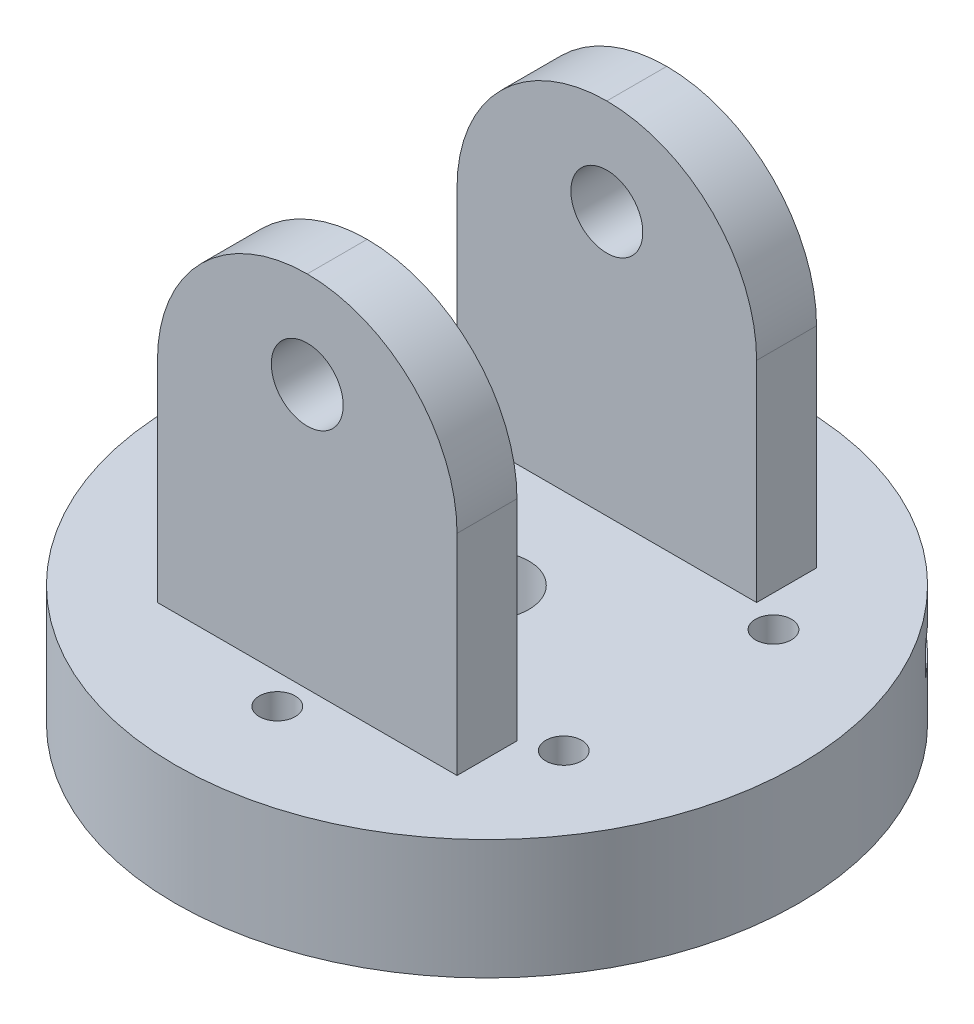
ISO-10303-21;
HEADER;
FILE_DESCRIPTION(('STEP AP214'),'2;1');
FILE_NAME('part.step','',(''),(''),'','','');
FILE_SCHEMA(('AUTOMOTIVE_DESIGN { 1 0 10303 214 1 1 1 1 }'));
ENDSEC;
DATA;
#1=APPLICATION_CONTEXT('core data for automotive mechanical design processes');
#2=APPLICATION_PROTOCOL_DEFINITION('international standard','automotive_design',2000,#1);
#3=PRODUCT_CONTEXT('',#1,'mechanical');
#4=PRODUCT('Part','Part','',(#3));
#5=PRODUCT_RELATED_PRODUCT_CATEGORY('part','',(#4));
#6=PRODUCT_DEFINITION_FORMATION('','',#4);
#7=PRODUCT_DEFINITION_CONTEXT('part definition',#1,'design');
#8=PRODUCT_DEFINITION('design','',#6,#7);
#9=PRODUCT_DEFINITION_SHAPE('','',#8);
#10=(LENGTH_UNIT() NAMED_UNIT(*) SI_UNIT(.MILLI.,.METRE.));
#11=(NAMED_UNIT(*) PLANE_ANGLE_UNIT() SI_UNIT($,.RADIAN.));
#12=(NAMED_UNIT(*) SI_UNIT($,.STERADIAN.) SOLID_ANGLE_UNIT());
#13=UNCERTAINTY_MEASURE_WITH_UNIT(LENGTH_MEASURE(1.E-05),#10,'distance_accuracy_value','');
#14=(GEOMETRIC_REPRESENTATION_CONTEXT(3) GLOBAL_UNCERTAINTY_ASSIGNED_CONTEXT((#13)) GLOBAL_UNIT_ASSIGNED_CONTEXT((#10,
#11,#12)) REPRESENTATION_CONTEXT('',''));
#15=CARTESIAN_POINT('',(0.,0.,0.));
#16=DIRECTION('',(0.,0.,1.));
#17=DIRECTION('',(1.,0.,0.));
#18=AXIS2_PLACEMENT_3D('',#15,#16,#17);
#19=CARTESIAN_POINT('',(0.,20.,35.));
#20=DIRECTION('',(0.,-1.,0.));
#21=DIRECTION('',(0.,0.,-1.));
#22=AXIS2_PLACEMENT_3D('',#19,#20,#21);
#23=CYLINDRICAL_SURFACE('',#22,1.6);
#24=CARTESIAN_POINT('',(0.,0.,35.));
#25=DIRECTION('',(0.,-1.,0.));
#26=DIRECTION('',(0.,0.,-1.));
#27=AXIS2_PLACEMENT_3D('',#24,#25,#26);
#28=CIRCLE('',#27,1.6);
#29=CARTESIAN_POINT('',(0.,0.,33.4));
#30=VERTEX_POINT('',#29);
#31=EDGE_CURVE('E262',#30,#30,#28,.T.);
#32=ORIENTED_EDGE('',*,*,#31,.T.);
#33=EDGE_LOOP('',(#32));
#34=FACE_BOUND('',#33,.T.);
#35=CARTESIAN_POINT('',(0.,11.,35.));
#36=DIRECTION('',(0.,1.,0.));
#37=DIRECTION('',(0.,0.,1.));
#38=AXIS2_PLACEMENT_3D('',#35,#36,#37);
#39=CIRCLE('',#38,1.6);
#40=CARTESIAN_POINT('',(0.,11.,36.6));
#41=VERTEX_POINT('',#40);
#42=EDGE_CURVE('E258',#41,#41,#39,.F.);
#43=ORIENTED_EDGE('',*,*,#42,.F.);
#44=EDGE_LOOP('',(#43));
#45=FACE_BOUND('',#44,.T.);
#46=ADVANCED_FACE('F39',(#34,#45),#23,.F.);
#47=CARTESIAN_POINT('',(30.3108891324554,20.,17.4999999999999));
#48=DIRECTION('',(0.,-1.,0.));
#49=DIRECTION('',(0.,0.,-1.));
#50=AXIS2_PLACEMENT_3D('',#47,#48,#49);
#51=CYLINDRICAL_SURFACE('',#50,1.6);
#52=CARTESIAN_POINT('',(30.3108891324554,0.,17.4999999999999));
#53=DIRECTION('',(0.,-1.,0.));
#54=DIRECTION('',(-0.86602540378444,0.,-0.499999999999998));
#55=AXIS2_PLACEMENT_3D('',#52,#53,#54);
#56=CIRCLE('',#55,1.6);
#57=CARTESIAN_POINT('',(28.9252484864003,0.,16.6999999999999));
#58=VERTEX_POINT('',#57);
#59=EDGE_CURVE('E245',#58,#58,#56,.T.);
#60=ORIENTED_EDGE('',*,*,#59,.T.);
#61=EDGE_LOOP('',(#60));
#62=FACE_BOUND('',#61,.T.);
#63=CARTESIAN_POINT('',(30.3108891324554,11.,17.4999999999999));
#64=DIRECTION('',(0.,1.,0.));
#65=DIRECTION('',(0.,0.,1.));
#66=AXIS2_PLACEMENT_3D('',#63,#64,#65);
#67=CIRCLE('',#66,1.6);
#68=CARTESIAN_POINT('',(30.3108891324554,11.,19.0999999999999));
#69=VERTEX_POINT('',#68);
#70=EDGE_CURVE('E402',#69,#69,#67,.F.);
#71=ORIENTED_EDGE('',*,*,#70,.F.);
#72=EDGE_LOOP('',(#71));
#73=FACE_BOUND('',#72,.T.);
#74=ADVANCED_FACE('F437',(#62,#73),#51,.F.);
#75=CARTESIAN_POINT('',(30.3108891324553,20.,-17.5000000000001));
#76=DIRECTION('',(0.,-1.,0.));
#77=DIRECTION('',(0.,0.,-1.));
#78=AXIS2_PLACEMENT_3D('',#75,#76,#77);
#79=CYLINDRICAL_SURFACE('',#78,1.6);
#80=CARTESIAN_POINT('',(30.3108891324553,10.,-17.5000000000001));
#81=DIRECTION('',(0.,-1.,0.));
#82=DIRECTION('',(0.,0.,-1.));
#83=AXIS2_PLACEMENT_3D('',#80,#81,#82);
#84=CIRCLE('',#83,1.6);
#85=CARTESIAN_POINT('',(30.3108891324553,10.,-19.1000000000001));
#86=VERTEX_POINT('',#85);
#87=EDGE_CURVE('E200',#86,#86,#84,.F.);
#88=ORIENTED_EDGE('',*,*,#87,.T.);
#89=EDGE_LOOP('',(#88));
#90=FACE_BOUND('',#89,.T.);
#91=CARTESIAN_POINT('',(30.3108891324553,0.,-17.5000000000001));
#92=DIRECTION('',(0.,-1.,0.));
#93=DIRECTION('',(-0.866025403784436,0.,0.500000000000004));
#94=AXIS2_PLACEMENT_3D('',#91,#92,#93);
#95=CIRCLE('',#94,1.6);
#96=CARTESIAN_POINT('',(28.9252484864002,0.,-16.7000000000001));
#97=VERTEX_POINT('',#96);
#98=EDGE_CURVE('E241',#97,#97,#95,.T.);
#99=ORIENTED_EDGE('',*,*,#98,.T.);
#100=EDGE_LOOP('',(#99));
#101=FACE_BOUND('',#100,.T.);
#102=ADVANCED_FACE('F443',(#90,#101),#79,.F.);
#103=CARTESIAN_POINT('',(0.,20.,-35.));
#104=DIRECTION('',(0.,-1.,0.));
#105=DIRECTION('',(0.,0.,-1.));
#106=AXIS2_PLACEMENT_3D('',#103,#104,#105);
#107=CYLINDRICAL_SURFACE('',#106,1.6);
#108=CARTESIAN_POINT('',(0.,10.,-35.));
#109=DIRECTION('',(0.,-1.,0.));
#110=DIRECTION('',(0.,0.,-1.));
#111=AXIS2_PLACEMENT_3D('',#108,#109,#110);
#112=CIRCLE('',#111,1.6);
#113=CARTESIAN_POINT('',(0.,10.,-36.6));
#114=VERTEX_POINT('',#113);
#115=EDGE_CURVE('E196',#114,#114,#112,.F.);
#116=ORIENTED_EDGE('',*,*,#115,.T.);
#117=EDGE_LOOP('',(#116));
#118=FACE_BOUND('',#117,.T.);
#119=CARTESIAN_POINT('',(0.,0.,-35.));
#120=DIRECTION('',(0.,-1.,0.));
#121=DIRECTION('',(0.,0.,1.));
#122=AXIS2_PLACEMENT_3D('',#119,#120,#121);
#123=CIRCLE('',#122,1.6);
#124=CARTESIAN_POINT('',(0.,0.,-33.4));
#125=VERTEX_POINT('',#124);
#126=EDGE_CURVE('E246',#125,#125,#123,.T.);
#127=ORIENTED_EDGE('',*,*,#126,.T.);
#128=EDGE_LOOP('',(#127));
#129=FACE_BOUND('',#128,.T.);
#130=ADVANCED_FACE('F612',(#118,#129),#107,.F.);
#131=CARTESIAN_POINT('',(-30.3108891324555,20.,-17.4999999999997));
#132=DIRECTION('',(0.,-1.,0.));
#133=DIRECTION('',(0.,0.,-1.));
#134=AXIS2_PLACEMENT_3D('',#131,#132,#133);
#135=CYLINDRICAL_SURFACE('',#134,1.6);
#136=CARTESIAN_POINT('',(-30.3108891324555,10.,-17.4999999999997));
#137=DIRECTION('',(0.,-1.,0.));
#138=DIRECTION('',(0.,0.,-1.));
#139=AXIS2_PLACEMENT_3D('',#136,#137,#138);
#140=CIRCLE('',#139,1.6);
#141=CARTESIAN_POINT('',(-30.3108891324555,10.,-19.0999999999997));
#142=VERTEX_POINT('',#141);
#143=EDGE_CURVE('E192',#142,#142,#140,.F.);
#144=ORIENTED_EDGE('',*,*,#143,.T.);
#145=EDGE_LOOP('',(#144));
#146=FACE_BOUND('',#145,.T.);
#147=CARTESIAN_POINT('',(-30.3108891324555,0.,-17.4999999999997));
#148=DIRECTION('',(0.,-1.,0.));
#149=DIRECTION('',(0.866025403784443,0.,0.499999999999992));
#150=AXIS2_PLACEMENT_3D('',#147,#148,#149);
#151=CIRCLE('',#150,1.6);
#152=CARTESIAN_POINT('',(-28.9252484864004,0.,-16.6999999999997));
#153=VERTEX_POINT('',#152);
#154=EDGE_CURVE('E250',#153,#153,#151,.T.);
#155=ORIENTED_EDGE('',*,*,#154,.T.);
#156=EDGE_LOOP('',(#155));
#157=FACE_BOUND('',#156,.T.);
#158=ADVANCED_FACE('F605',(#146,#157),#135,.F.);
#159=CARTESIAN_POINT('',(-30.3108891324552,20.,17.5000000000004));
#160=DIRECTION('',(0.,-1.,0.));
#161=DIRECTION('',(0.,0.,-1.));
#162=AXIS2_PLACEMENT_3D('',#159,#160,#161);
#163=CYLINDRICAL_SURFACE('',#162,1.6);
#164=CARTESIAN_POINT('',(-30.3108891324552,0.,17.5000000000004));
#165=DIRECTION('',(0.,-1.,0.));
#166=DIRECTION('',(0.866025403784433,0.,-0.50000000000001));
#167=AXIS2_PLACEMENT_3D('',#164,#165,#166);
#168=CIRCLE('',#167,1.6);
#169=CARTESIAN_POINT('',(-28.9252484864001,0.,16.7000000000003));
#170=VERTEX_POINT('',#169);
#171=EDGE_CURVE('E254',#170,#170,#168,.T.);
#172=ORIENTED_EDGE('',*,*,#171,.T.);
#173=EDGE_LOOP('',(#172));
#174=FACE_BOUND('',#173,.T.);
#175=CARTESIAN_POINT('',(-30.3108891324552,11.,17.5000000000004));
#176=DIRECTION('',(0.,1.,0.));
#177=DIRECTION('',(0.,0.,1.));
#178=AXIS2_PLACEMENT_3D('',#175,#176,#177);
#179=CIRCLE('',#178,1.6);
#180=CARTESIAN_POINT('',(-30.3108891324552,11.,19.1000000000004));
#181=VERTEX_POINT('',#180);
#182=EDGE_CURVE('E240',#181,#181,#179,.F.);
#183=ORIENTED_EDGE('',*,*,#182,.F.);
#184=EDGE_LOOP('',(#183));
#185=FACE_BOUND('',#184,.T.);
#186=ADVANCED_FACE('F501',(#174,#185),#163,.F.);
#187=CARTESIAN_POINT('',(0.,20.,0.));
#188=DIRECTION('',(0.,1.,0.));
#189=DIRECTION('',(0.,0.,1.));
#190=AXIS2_PLACEMENT_3D('',#187,#188,#189);
#191=PLANE('',#190);
#192=CARTESIAN_POINT('',(2.41126563160776E-13,20.,-35.));
#193=DIRECTION('',(0.,1.,0.));
#194=DIRECTION('',(0.,0.,1.));
#195=AXIS2_PLACEMENT_3D('',#192,#193,#194);
#196=CIRCLE('',#195,2.99999999999999);
#197=CARTESIAN_POINT('',(2.41126563160776E-13,20.,-32.));
#198=VERTEX_POINT('',#197);
#199=EDGE_CURVE('E204',#198,#198,#196,.T.);
#200=ORIENTED_EDGE('',*,*,#199,.F.);
#201=EDGE_LOOP('',(#200));
#202=FACE_BOUND('',#201,.T.);
#203=CARTESIAN_POINT('',(-30.3108891324555,20.,-17.499999999999));
#204=DIRECTION('',(0.,1.,0.));
#205=DIRECTION('',(0.,0.,1.));
#206=AXIS2_PLACEMENT_3D('',#203,#204,#205);
#207=CIRCLE('',#206,3.00000000000064);
#208=CARTESIAN_POINT('',(-30.3108891324555,20.,-14.4999999999984));
#209=VERTEX_POINT('',#208);
#210=EDGE_CURVE('E230',#209,#209,#207,.T.);
#211=ORIENTED_EDGE('',*,*,#210,.F.);
#212=EDGE_LOOP('',(#211));
#213=FACE_BOUND('',#212,.T.);
#214=CARTESIAN_POINT('',(-30.3108891324548,20.,17.500000000001));
#215=DIRECTION('',(0.,1.,0.));
#216=DIRECTION('',(0.,0.,1.));
#217=AXIS2_PLACEMENT_3D('',#214,#215,#216);
#218=CIRCLE('',#217,3.00000000000027);
#219=CARTESIAN_POINT('',(-30.3108891324548,20.,20.5000000000013));
#220=VERTEX_POINT('',#219);
#221=EDGE_CURVE('E226',#220,#220,#218,.T.);
#222=ORIENTED_EDGE('',*,*,#221,.F.);
#223=EDGE_LOOP('',(#222));
#224=FACE_BOUND('',#223,.T.);
#225=CARTESIAN_POINT('',(8.90916069591342E-13,20.,35.0000000000004));
#226=DIRECTION('',(0.,1.,0.));
#227=DIRECTION('',(0.,0.,1.));
#228=AXIS2_PLACEMENT_3D('',#225,#226,#227);
#229=CIRCLE('',#228,2.99999999999978);
#230=CARTESIAN_POINT('',(8.90916069591342E-13,20.,38.0000000000002));
#231=VERTEX_POINT('',#230);
#232=EDGE_CURVE('E218',#231,#231,#229,.T.);
#233=ORIENTED_EDGE('',*,*,#232,.F.);
#234=EDGE_LOOP('',(#233));
#235=FACE_BOUND('',#234,.T.);
#236=CARTESIAN_POINT('',(30.3108891324554,20.,17.4999999999999));
#237=DIRECTION('',(0.,1.,0.));
#238=DIRECTION('',(0.,0.,1.));
#239=AXIS2_PLACEMENT_3D('',#236,#237,#238);
#240=CIRCLE('',#239,2.99999999999999);
#241=CARTESIAN_POINT('',(30.3108891324554,20.,20.4999999999999));
#242=VERTEX_POINT('',#241);
#243=EDGE_CURVE('E210',#242,#242,#240,.T.);
#244=ORIENTED_EDGE('',*,*,#243,.F.);
#245=EDGE_LOOP('',(#244));
#246=FACE_BOUND('',#245,.T.);
#247=CARTESIAN_POINT('',(30.3108891324553,20.,-17.5000000000001));
#248=DIRECTION('',(0.,1.,0.));
#249=DIRECTION('',(0.,0.,1.));
#250=AXIS2_PLACEMENT_3D('',#247,#248,#249);
#251=CIRCLE('',#250,3.);
#252=CARTESIAN_POINT('',(30.3108891324553,20.,-14.5000000000001));
#253=VERTEX_POINT('',#252);
#254=EDGE_CURVE('E209',#253,#253,#251,.T.);
#255=ORIENTED_EDGE('',*,*,#254,.F.);
#256=EDGE_LOOP('',(#255));
#257=FACE_BOUND('',#256,.T.);
#258=DIRECTION('',(0.,0.,-1.));
#259=VECTOR('',#258,1.);
#260=CARTESIAN_POINT('',(25.,20.,-20.));
#261=LINE('',#260,#259);
#262=CARTESIAN_POINT('',(25.,20.,-20.));
#263=VERTEX_POINT('',#262);
#264=CARTESIAN_POINT('',(25.,20.,-30.));
#265=VERTEX_POINT('',#264);
#266=EDGE_CURVE('E305',#263,#265,#261,.T.);
#267=ORIENTED_EDGE('',*,*,#266,.F.);
#268=DIRECTION('',(1.,0.,0.));
#269=VECTOR('',#268,1.);
#270=CARTESIAN_POINT('',(25.,20.,-20.));
#271=LINE('',#270,#269);
#272=CARTESIAN_POINT('',(-25.,20.,-20.));
#273=VERTEX_POINT('',#272);
#274=EDGE_CURVE('E318',#273,#263,#271,.T.);
#275=ORIENTED_EDGE('',*,*,#274,.F.);
#276=DIRECTION('',(0.,0.,1.));
#277=VECTOR('',#276,1.);
#278=CARTESIAN_POINT('',(-25.,20.,-20.));
#279=LINE('',#278,#277);
#280=CARTESIAN_POINT('',(-25.,20.,-30.));
#281=VERTEX_POINT('',#280);
#282=EDGE_CURVE('E314',#281,#273,#279,.T.);
#283=ORIENTED_EDGE('',*,*,#282,.F.);
#284=DIRECTION('',(-1.,0.,0.));
#285=VECTOR('',#284,1.);
#286=CARTESIAN_POINT('',(25.,20.,-30.));
#287=LINE('',#286,#285);
#288=EDGE_CURVE('E309',#265,#281,#287,.T.);
#289=ORIENTED_EDGE('',*,*,#288,.F.);
#290=EDGE_LOOP('',(#267,#275,#283,#289));
#291=FACE_BOUND('',#290,.T.);
#292=CARTESIAN_POINT('',(0.,20.,0.));
#293=DIRECTION('',(0.,1.,0.));
#294=DIRECTION('',(0.,0.,1.));
#295=AXIS2_PLACEMENT_3D('',#292,#293,#294);
#296=CIRCLE('',#295,52.);
#297=CARTESIAN_POINT('',(0.,20.,52.));
#298=VERTEX_POINT('',#297);
#299=EDGE_CURVE('E343',#298,#298,#296,.T.);
#300=ORIENTED_EDGE('',*,*,#299,.T.);
#301=EDGE_LOOP('',(#300));
#302=FACE_BOUND('',#301,.T.);
#303=CARTESIAN_POINT('',(0.,20.,0.));
#304=DIRECTION('',(0.,1.,0.));
#305=DIRECTION('',(0.,0.,1.));
#306=AXIS2_PLACEMENT_3D('',#303,#304,#305);
#307=CIRCLE('',#306,7.);
#308=CARTESIAN_POINT('',(0.,20.,7.));
#309=VERTEX_POINT('',#308);
#310=EDGE_CURVE('E335',#309,#309,#307,.T.);
#311=ORIENTED_EDGE('',*,*,#310,.F.);
#312=EDGE_LOOP('',(#311));
#313=FACE_BOUND('',#312,.T.);
#314=DIRECTION('',(1.,0.,0.));
#315=VECTOR('',#314,1.);
#316=CARTESIAN_POINT('',(-25.,20.,30.));
#317=LINE('',#316,#315);
#318=CARTESIAN_POINT('',(-25.,20.,30.));
#319=VERTEX_POINT('',#318);
#320=CARTESIAN_POINT('',(25.,20.,30.));
#321=VERTEX_POINT('',#320);
#322=EDGE_CURVE('E275',#319,#321,#317,.T.);
#323=ORIENTED_EDGE('',*,*,#322,.F.);
#324=DIRECTION('',(0.,0.,1.));
#325=VECTOR('',#324,1.);
#326=CARTESIAN_POINT('',(-25.,20.,20.));
#327=LINE('',#326,#325);
#328=CARTESIAN_POINT('',(-25.,20.,20.));
#329=VERTEX_POINT('',#328);
#330=EDGE_CURVE('E271',#329,#319,#327,.T.);
#331=ORIENTED_EDGE('',*,*,#330,.F.);
#332=DIRECTION('',(-1.,0.,0.));
#333=VECTOR('',#332,1.);
#334=CARTESIAN_POINT('',(-25.,20.,20.));
#335=LINE('',#334,#333);
#336=CARTESIAN_POINT('',(25.,20.,20.));
#337=VERTEX_POINT('',#336);
#338=EDGE_CURVE('E284',#337,#329,#335,.T.);
#339=ORIENTED_EDGE('',*,*,#338,.F.);
#340=DIRECTION('',(0.,0.,-1.));
#341=VECTOR('',#340,1.);
#342=CARTESIAN_POINT('',(25.,20.,20.));
#343=LINE('',#342,#341);
#344=EDGE_CURVE('E280',#321,#337,#343,.T.);
#345=ORIENTED_EDGE('',*,*,#344,.F.);
#346=EDGE_LOOP('',(#323,#331,#339,#345));
#347=FACE_BOUND('',#346,.T.);
#348=ADVANCED_FACE('F497',(#202,#213,#224,#235,#246,#257,#291,#302,#313,#347),#191,.T.);
#349=CARTESIAN_POINT('',(0.,0.,0.));
#350=DIRECTION('',(0.,1.,0.));
#351=DIRECTION('',(0.,0.,1.));
#352=AXIS2_PLACEMENT_3D('',#349,#350,#351);
#353=PLANE('',#352);
#354=ORIENTED_EDGE('',*,*,#171,.F.);
#355=EDGE_LOOP('',(#354));
#356=FACE_BOUND('',#355,.T.);
#357=ORIENTED_EDGE('',*,*,#154,.F.);
#358=EDGE_LOOP('',(#357));
#359=FACE_BOUND('',#358,.T.);
#360=ORIENTED_EDGE('',*,*,#126,.F.);
#361=EDGE_LOOP('',(#360));
#362=FACE_BOUND('',#361,.T.);
#363=ORIENTED_EDGE('',*,*,#98,.F.);
#364=EDGE_LOOP('',(#363));
#365=FACE_BOUND('',#364,.T.);
#366=ORIENTED_EDGE('',*,*,#59,.F.);
#367=EDGE_LOOP('',(#366));
#368=FACE_BOUND('',#367,.T.);
#369=ORIENTED_EDGE('',*,*,#31,.F.);
#370=EDGE_LOOP('',(#369));
#371=FACE_BOUND('',#370,.T.);
#372=CARTESIAN_POINT('',(0.,0.,0.));
#373=DIRECTION('',(0.,1.,0.));
#374=DIRECTION('',(0.,0.,1.));
#375=AXIS2_PLACEMENT_3D('',#372,#373,#374);
#376=CIRCLE('',#375,52.);
#377=CARTESIAN_POINT('',(0.,0.,52.));
#378=VERTEX_POINT('',#377);
#379=EDGE_CURVE('E339',#378,#378,#376,.T.);
#380=ORIENTED_EDGE('',*,*,#379,.F.);
#381=EDGE_LOOP('',(#380));
#382=FACE_BOUND('',#381,.T.);
#383=CARTESIAN_POINT('',(0.,0.,0.));
#384=DIRECTION('',(0.,1.,0.));
#385=DIRECTION('',(0.,0.,1.));
#386=AXIS2_PLACEMENT_3D('',#383,#384,#385);
#387=CIRCLE('',#386,7.);
#388=CARTESIAN_POINT('',(0.,0.,7.));
#389=VERTEX_POINT('',#388);
#390=EDGE_CURVE('E334',#389,#389,#387,.T.);
#391=ORIENTED_EDGE('',*,*,#390,.T.);
#392=EDGE_LOOP('',(#391));
#393=FACE_BOUND('',#392,.T.);
#394=ADVANCED_FACE('F500',(#356,#359,#362,#365,#368,#371,#382,#393),#353,.F.);
#395=CARTESIAN_POINT('',(0.,20.,0.));
#396=DIRECTION('',(0.,-1.,0.));
#397=DIRECTION('',(0.,0.,-1.));
#398=AXIS2_PLACEMENT_3D('',#395,#396,#397);
#399=CYLINDRICAL_SURFACE('',#398,52.);
#400=CARTESIAN_POINT('',(0.,15.,0.));
#401=DIRECTION('',(0.,1.,0.));
#402=DIRECTION('',(0.,0.,1.));
#403=AXIS2_PLACEMENT_3D('',#400,#401,#402);
#404=CIRCLE('',#403,52.);
#405=CARTESIAN_POINT('',(40.05,15.,-33.1662102146145));
#406=VERTEX_POINT('',#405);
#407=CARTESIAN_POINT('',(-40.05,15.,-33.1662102146145));
#408=VERTEX_POINT('',#407);
#409=EDGE_CURVE('E188',#406,#408,#404,.T.);
#410=ORIENTED_EDGE('',*,*,#409,.T.);
#411=DIRECTION('',(0.,-1.,0.));
#412=VECTOR('',#411,1.);
#413=CARTESIAN_POINT('',(-40.05,20.,-33.1662102146145));
#414=LINE('',#413,#412);
#415=CARTESIAN_POINT('',(-40.05,10.,-33.1662102146145));
#416=VERTEX_POINT('',#415);
#417=EDGE_CURVE('E11',#408,#416,#414,.T.);
#418=ORIENTED_EDGE('',*,*,#417,.T.);
#419=CARTESIAN_POINT('',(0.,10.,0.));
#420=DIRECTION('',(0.,-1.,0.));
#421=DIRECTION('',(0.,0.,-1.));
#422=AXIS2_PLACEMENT_3D('',#419,#420,#421);
#423=CIRCLE('',#422,52.);
#424=CARTESIAN_POINT('',(40.05,10.,-33.1662102146145));
#425=VERTEX_POINT('',#424);
#426=EDGE_CURVE('E145',#416,#425,#423,.T.);
#427=ORIENTED_EDGE('',*,*,#426,.T.);
#428=DIRECTION('',(0.,-1.,0.));
#429=VECTOR('',#428,1.);
#430=CARTESIAN_POINT('',(40.05,20.,-33.1662102146145));
#431=LINE('',#430,#429);
#432=EDGE_CURVE('E48',#425,#406,#431,.F.);
#433=ORIENTED_EDGE('',*,*,#432,.T.);
#434=EDGE_LOOP('',(#410,#418,#427,#433));
#435=FACE_BOUND('',#434,.T.);
#436=ORIENTED_EDGE('',*,*,#299,.F.);
#437=EDGE_LOOP('',(#436));
#438=FACE_BOUND('',#437,.T.);
#439=ORIENTED_EDGE('',*,*,#379,.T.);
#440=EDGE_LOOP('',(#439));
#441=FACE_BOUND('',#440,.T.);
#442=ADVANCED_FACE('F416',(#435,#438,#441),#399,.T.);
#443=CARTESIAN_POINT('',(0.,20.,0.));
#444=DIRECTION('',(0.,-1.,0.));
#445=DIRECTION('',(0.,0.,-1.));
#446=AXIS2_PLACEMENT_3D('',#443,#444,#445);
#447=CYLINDRICAL_SURFACE('',#446,7.);
#448=ORIENTED_EDGE('',*,*,#310,.T.);
#449=EDGE_LOOP('',(#448));
#450=FACE_BOUND('',#449,.T.);
#451=ORIENTED_EDGE('',*,*,#390,.F.);
#452=EDGE_LOOP('',(#451));
#453=FACE_BOUND('',#452,.T.);
#454=ADVANCED_FACE('F492',(#450,#453),#447,.F.);
#455=CARTESIAN_POINT('',(25.,80.,-20.));
#456=DIRECTION('',(-1.,0.,0.));
#457=DIRECTION('',(0.,0.,1.));
#458=AXIS2_PLACEMENT_3D('',#455,#456,#457);
#459=PLANE('',#458);
#460=DIRECTION('',(0.,-1.,0.));
#461=VECTOR('',#460,1.);
#462=CARTESIAN_POINT('',(25.,80.,-30.));
#463=LINE('',#462,#461);
#464=CARTESIAN_POINT('',(25.,55.,-30.));
#465=VERTEX_POINT('',#464);
#466=EDGE_CURVE('E331',#465,#265,#463,.T.);
#467=ORIENTED_EDGE('',*,*,#466,.F.);
#468=DIRECTION('',(0.,0.,-1.));
#469=VECTOR('',#468,1.);
#470=CARTESIAN_POINT('',(25.,55.,-20.));
#471=LINE('',#470,#469);
#472=CARTESIAN_POINT('',(25.,55.,-20.));
#473=VERTEX_POINT('',#472);
#474=EDGE_CURVE('E356',#465,#473,#471,.F.);
#475=ORIENTED_EDGE('',*,*,#474,.T.);
#476=DIRECTION('',(0.,-1.,0.));
#477=VECTOR('',#476,1.);
#478=CARTESIAN_POINT('',(25.,80.,-20.));
#479=LINE('',#478,#477);
#480=EDGE_CURVE('E322',#473,#263,#479,.T.);
#481=ORIENTED_EDGE('',*,*,#480,.T.);
#482=ORIENTED_EDGE('',*,*,#266,.T.);
#483=EDGE_LOOP('',(#467,#475,#481,#482));
#484=FACE_BOUND('',#483,.T.);
#485=ADVANCED_FACE('F488',(#484),#459,.F.);
#486=CARTESIAN_POINT('',(25.,80.,-30.));
#487=DIRECTION('',(0.,0.,1.));
#488=DIRECTION('',(1.,0.,0.));
#489=AXIS2_PLACEMENT_3D('',#486,#487,#488);
#490=PLANE('',#489);
#491=CARTESIAN_POINT('',(0.,64.,-30.));
#492=DIRECTION('',(0.,0.,-1.));
#493=DIRECTION('',(-1.,0.,0.));
#494=AXIS2_PLACEMENT_3D('',#491,#492,#493);
#495=CIRCLE('',#494,6.);
#496=CARTESIAN_POINT('',(-6.,64.,-30.));
#497=VERTEX_POINT('',#496);
#498=EDGE_CURVE('E300',#497,#497,#495,.T.);
#499=ORIENTED_EDGE('',*,*,#498,.F.);
#500=EDGE_LOOP('',(#499));
#501=FACE_BOUND('',#500,.T.);
#502=CARTESIAN_POINT('',(0.,55.,-30.));
#503=DIRECTION('',(0.,0.,1.));
#504=DIRECTION('',(1.,0.,0.));
#505=AXIS2_PLACEMENT_3D('',#502,#503,#504);
#506=CIRCLE('',#505,25.);
#507=CARTESIAN_POINT('',(-25.,55.,-30.));
#508=VERTEX_POINT('',#507);
#509=CARTESIAN_POINT('',(0.,80.,-30.));
#510=VERTEX_POINT('',#509);
#511=EDGE_CURVE('E347',#508,#510,#506,.F.);
#512=ORIENTED_EDGE('',*,*,#511,.T.);
#513=CARTESIAN_POINT('',(0.,55.,-30.));
#514=DIRECTION('',(0.,0.,1.));
#515=DIRECTION('',(1.,0.,0.));
#516=AXIS2_PLACEMENT_3D('',#513,#514,#515);
#517=CIRCLE('',#516,25.);
#518=EDGE_CURVE('E353',#510,#465,#517,.F.);
#519=ORIENTED_EDGE('',*,*,#518,.T.);
#520=ORIENTED_EDGE('',*,*,#466,.T.);
#521=ORIENTED_EDGE('',*,*,#288,.T.);
#522=DIRECTION('',(0.,-1.,0.));
#523=VECTOR('',#522,1.);
#524=CARTESIAN_POINT('',(-25.,80.,-30.));
#525=LINE('',#524,#523);
#526=EDGE_CURVE('E328',#508,#281,#525,.T.);
#527=ORIENTED_EDGE('',*,*,#526,.F.);
#528=EDGE_LOOP('',(#512,#519,#520,#521,#527));
#529=FACE_BOUND('',#528,.T.);
#530=ADVANCED_FACE('F484',(#501,#529),#490,.F.);
#531=CARTESIAN_POINT('',(-25.,80.,-20.));
#532=DIRECTION('',(1.,0.,0.));
#533=DIRECTION('',(0.,0.,-1.));
#534=AXIS2_PLACEMENT_3D('',#531,#532,#533);
#535=PLANE('',#534);
#536=DIRECTION('',(0.,-1.,0.));
#537=VECTOR('',#536,1.);
#538=CARTESIAN_POINT('',(-25.,80.,-20.));
#539=LINE('',#538,#537);
#540=CARTESIAN_POINT('',(-25.,55.,-20.));
#541=VERTEX_POINT('',#540);
#542=EDGE_CURVE('E325',#541,#273,#539,.T.);
#543=ORIENTED_EDGE('',*,*,#542,.F.);
#544=DIRECTION('',(0.,0.,1.));
#545=VECTOR('',#544,1.);
#546=CARTESIAN_POINT('',(-25.,55.,-30.));
#547=LINE('',#546,#545);
#548=EDGE_CURVE('E366',#541,#508,#547,.F.);
#549=ORIENTED_EDGE('',*,*,#548,.T.);
#550=ORIENTED_EDGE('',*,*,#526,.T.);
#551=ORIENTED_EDGE('',*,*,#282,.T.);
#552=EDGE_LOOP('',(#543,#549,#550,#551));
#553=FACE_BOUND('',#552,.T.);
#554=ADVANCED_FACE('F480',(#553),#535,.F.);
#555=CARTESIAN_POINT('',(25.,80.,-20.));
#556=DIRECTION('',(0.,0.,-1.));
#557=DIRECTION('',(-1.,0.,0.));
#558=AXIS2_PLACEMENT_3D('',#555,#556,#557);
#559=PLANE('',#558);
#560=CARTESIAN_POINT('',(0.,64.,-20.));
#561=DIRECTION('',(0.,0.,-1.));
#562=DIRECTION('',(-1.,0.,0.));
#563=AXIS2_PLACEMENT_3D('',#560,#561,#562);
#564=CIRCLE('',#563,6.);
#565=CARTESIAN_POINT('',(-6.,64.,-20.));
#566=VERTEX_POINT('',#565);
#567=EDGE_CURVE('E304',#566,#566,#564,.T.);
#568=ORIENTED_EDGE('',*,*,#567,.T.);
#569=EDGE_LOOP('',(#568));
#570=FACE_BOUND('',#569,.T.);
#571=ORIENTED_EDGE('',*,*,#480,.F.);
#572=CARTESIAN_POINT('',(0.,55.,-20.));
#573=DIRECTION('',(0.,0.,-1.));
#574=DIRECTION('',(-1.,0.,0.));
#575=AXIS2_PLACEMENT_3D('',#572,#573,#574);
#576=CIRCLE('',#575,25.);
#577=CARTESIAN_POINT('',(0.,80.,-20.));
#578=VERTEX_POINT('',#577);
#579=EDGE_CURVE('E363',#473,#578,#576,.F.);
#580=ORIENTED_EDGE('',*,*,#579,.T.);
#581=CARTESIAN_POINT('',(0.,55.,-20.));
#582=DIRECTION('',(0.,0.,-1.));
#583=DIRECTION('',(-1.,0.,0.));
#584=AXIS2_PLACEMENT_3D('',#581,#582,#583);
#585=CIRCLE('',#584,25.);
#586=EDGE_CURVE('E360',#578,#541,#585,.F.);
#587=ORIENTED_EDGE('',*,*,#586,.T.);
#588=ORIENTED_EDGE('',*,*,#542,.T.);
#589=ORIENTED_EDGE('',*,*,#274,.T.);
#590=EDGE_LOOP('',(#571,#580,#587,#588,#589));
#591=FACE_BOUND('',#590,.T.);
#592=ADVANCED_FACE('F476',(#570,#591),#559,.F.);
#593=CARTESIAN_POINT('',(0.,55.,0.));
#594=DIRECTION('',(0.,0.,-1.));
#595=DIRECTION('',(-1.,0.,0.));
#596=AXIS2_PLACEMENT_3D('',#593,#594,#595);
#597=CYLINDRICAL_SURFACE('',#596,25.);
#598=ORIENTED_EDGE('',*,*,#548,.F.);
#599=ORIENTED_EDGE('',*,*,#586,.F.);
#600=DIRECTION('',(0.,0.,1.));
#601=VECTOR('',#600,1.);
#602=CARTESIAN_POINT('',(0.,80.,-20.));
#603=LINE('',#602,#601);
#604=EDGE_CURVE('E310',#510,#578,#603,.T.);
#605=ORIENTED_EDGE('',*,*,#604,.F.);
#606=ORIENTED_EDGE('',*,*,#511,.F.);
#607=EDGE_LOOP('',(#598,#599,#605,#606));
#608=FACE_BOUND('',#607,.T.);
#609=ADVANCED_FACE('F479',(#608),#597,.T.);
#610=CARTESIAN_POINT('',(0.,55.,0.));
#611=DIRECTION('',(0.,0.,1.));
#612=DIRECTION('',(1.,0.,0.));
#613=AXIS2_PLACEMENT_3D('',#610,#611,#612);
#614=CYLINDRICAL_SURFACE('',#613,25.);
#615=ORIENTED_EDGE('',*,*,#579,.F.);
#616=ORIENTED_EDGE('',*,*,#474,.F.);
#617=ORIENTED_EDGE('',*,*,#518,.F.);
#618=ORIENTED_EDGE('',*,*,#604,.T.);
#619=EDGE_LOOP('',(#615,#616,#617,#618));
#620=FACE_BOUND('',#619,.T.);
#621=ADVANCED_FACE('F474',(#620),#614,.T.);
#622=CARTESIAN_POINT('',(0.,64.,10.));
#623=DIRECTION('',(0.,0.,-1.));
#624=DIRECTION('',(-1.,0.,0.));
#625=AXIS2_PLACEMENT_3D('',#622,#623,#624);
#626=CYLINDRICAL_SURFACE('',#625,6.);
#627=ORIENTED_EDGE('',*,*,#498,.T.);
#628=EDGE_LOOP('',(#627));
#629=FACE_BOUND('',#628,.T.);
#630=ORIENTED_EDGE('',*,*,#567,.F.);
#631=EDGE_LOOP('',(#630));
#632=FACE_BOUND('',#631,.T.);
#633=ADVANCED_FACE('F470',(#629,#632),#626,.F.);
#634=CARTESIAN_POINT('',(-25.,80.,20.));
#635=DIRECTION('',(1.,0.,0.));
#636=DIRECTION('',(0.,0.,-1.));
#637=AXIS2_PLACEMENT_3D('',#634,#635,#636);
#638=PLANE('',#637);
#639=DIRECTION('',(0.,-1.,0.));
#640=VECTOR('',#639,1.);
#641=CARTESIAN_POINT('',(-25.,80.,30.));
#642=LINE('',#641,#640);
#643=CARTESIAN_POINT('',(-25.,55.,30.));
#644=VERTEX_POINT('',#643);
#645=EDGE_CURVE('E297',#644,#319,#642,.T.);
#646=ORIENTED_EDGE('',*,*,#645,.F.);
#647=DIRECTION('',(0.,0.,1.));
#648=VECTOR('',#647,1.);
#649=CARTESIAN_POINT('',(-25.,55.,20.));
#650=LINE('',#649,#648);
#651=CARTESIAN_POINT('',(-25.,55.,20.));
#652=VERTEX_POINT('',#651);
#653=EDGE_CURVE('E381',#644,#652,#650,.F.);
#654=ORIENTED_EDGE('',*,*,#653,.T.);
#655=DIRECTION('',(0.,-1.,0.));
#656=VECTOR('',#655,1.);
#657=CARTESIAN_POINT('',(-25.,80.,20.));
#658=LINE('',#657,#656);
#659=EDGE_CURVE('E288',#652,#329,#658,.T.);
#660=ORIENTED_EDGE('',*,*,#659,.T.);
#661=ORIENTED_EDGE('',*,*,#330,.T.);
#662=EDGE_LOOP('',(#646,#654,#660,#661));
#663=FACE_BOUND('',#662,.T.);
#664=ADVANCED_FACE('F466',(#663),#638,.F.);
#665=CARTESIAN_POINT('',(-25.,80.,30.));
#666=DIRECTION('',(0.,0.,-1.));
#667=DIRECTION('',(-1.,0.,0.));
#668=AXIS2_PLACEMENT_3D('',#665,#666,#667);
#669=PLANE('',#668);
#670=CARTESIAN_POINT('',(0.,64.,30.));
#671=DIRECTION('',(0.,0.,1.));
#672=DIRECTION('',(1.,0.,0.));
#673=AXIS2_PLACEMENT_3D('',#670,#671,#672);
#674=CIRCLE('',#673,6.);
#675=CARTESIAN_POINT('',(6.,64.,30.));
#676=VERTEX_POINT('',#675);
#677=EDGE_CURVE('E266',#676,#676,#674,.T.);
#678=ORIENTED_EDGE('',*,*,#677,.F.);
#679=EDGE_LOOP('',(#678));
#680=FACE_BOUND('',#679,.T.);
#681=CARTESIAN_POINT('',(0.,55.,30.));
#682=DIRECTION('',(0.,0.,-1.));
#683=DIRECTION('',(-1.,0.,0.));
#684=AXIS2_PLACEMENT_3D('',#681,#682,#683);
#685=CIRCLE('',#684,25.);
#686=CARTESIAN_POINT('',(25.,55.,30.));
#687=VERTEX_POINT('',#686);
#688=CARTESIAN_POINT('',(0.,80.,30.));
#689=VERTEX_POINT('',#688);
#690=EDGE_CURVE('E369',#687,#689,#685,.F.);
#691=ORIENTED_EDGE('',*,*,#690,.T.);
#692=CARTESIAN_POINT('',(0.,55.,30.));
#693=DIRECTION('',(0.,0.,-1.));
#694=DIRECTION('',(-1.,0.,0.));
#695=AXIS2_PLACEMENT_3D('',#692,#693,#694);
#696=CIRCLE('',#695,25.);
#697=EDGE_CURVE('E378',#689,#644,#696,.F.);
#698=ORIENTED_EDGE('',*,*,#697,.T.);
#699=ORIENTED_EDGE('',*,*,#645,.T.);
#700=ORIENTED_EDGE('',*,*,#322,.T.);
#701=DIRECTION('',(0.,-1.,0.));
#702=VECTOR('',#701,1.);
#703=CARTESIAN_POINT('',(25.,80.,30.));
#704=LINE('',#703,#702);
#705=EDGE_CURVE('E294',#687,#321,#704,.T.);
#706=ORIENTED_EDGE('',*,*,#705,.F.);
#707=EDGE_LOOP('',(#691,#698,#699,#700,#706));
#708=FACE_BOUND('',#707,.T.);
#709=ADVANCED_FACE('F462',(#680,#708),#669,.F.);
#710=CARTESIAN_POINT('',(25.,80.,20.));
#711=DIRECTION('',(-1.,0.,0.));
#712=DIRECTION('',(0.,0.,1.));
#713=AXIS2_PLACEMENT_3D('',#710,#711,#712);
#714=PLANE('',#713);
#715=DIRECTION('',(0.,-1.,0.));
#716=VECTOR('',#715,1.);
#717=CARTESIAN_POINT('',(25.,80.,20.));
#718=LINE('',#717,#716);
#719=CARTESIAN_POINT('',(25.,55.,20.));
#720=VERTEX_POINT('',#719);
#721=EDGE_CURVE('E291',#720,#337,#718,.T.);
#722=ORIENTED_EDGE('',*,*,#721,.F.);
#723=DIRECTION('',(0.,0.,-1.));
#724=VECTOR('',#723,1.);
#725=CARTESIAN_POINT('',(25.,55.,30.));
#726=LINE('',#725,#724);
#727=EDGE_CURVE('E390',#720,#687,#726,.F.);
#728=ORIENTED_EDGE('',*,*,#727,.T.);
#729=ORIENTED_EDGE('',*,*,#705,.T.);
#730=ORIENTED_EDGE('',*,*,#344,.T.);
#731=EDGE_LOOP('',(#722,#728,#729,#730));
#732=FACE_BOUND('',#731,.T.);
#733=ADVANCED_FACE('F458',(#732),#714,.F.);
#734=CARTESIAN_POINT('',(-25.,80.,20.));
#735=DIRECTION('',(0.,0.,1.));
#736=DIRECTION('',(1.,0.,0.));
#737=AXIS2_PLACEMENT_3D('',#734,#735,#736);
#738=PLANE('',#737);
#739=CARTESIAN_POINT('',(0.,64.,20.));
#740=DIRECTION('',(0.,0.,1.));
#741=DIRECTION('',(1.,0.,0.));
#742=AXIS2_PLACEMENT_3D('',#739,#740,#741);
#743=CIRCLE('',#742,6.);
#744=CARTESIAN_POINT('',(6.,64.,20.));
#745=VERTEX_POINT('',#744);
#746=EDGE_CURVE('E270',#745,#745,#743,.T.);
#747=ORIENTED_EDGE('',*,*,#746,.T.);
#748=EDGE_LOOP('',(#747));
#749=FACE_BOUND('',#748,.T.);
#750=ORIENTED_EDGE('',*,*,#659,.F.);
#751=CARTESIAN_POINT('',(0.,55.,20.));
#752=DIRECTION('',(0.,0.,1.));
#753=DIRECTION('',(1.,0.,0.));
#754=AXIS2_PLACEMENT_3D('',#751,#752,#753);
#755=CIRCLE('',#754,25.);
#756=CARTESIAN_POINT('',(0.,80.,20.));
#757=VERTEX_POINT('',#756);
#758=EDGE_CURVE('E387',#652,#757,#755,.F.);
#759=ORIENTED_EDGE('',*,*,#758,.T.);
#760=CARTESIAN_POINT('',(0.,55.,20.));
#761=DIRECTION('',(0.,0.,1.));
#762=DIRECTION('',(1.,0.,0.));
#763=AXIS2_PLACEMENT_3D('',#760,#761,#762);
#764=CIRCLE('',#763,25.);
#765=EDGE_CURVE('E63',#757,#720,#764,.F.);
#766=ORIENTED_EDGE('',*,*,#765,.T.);
#767=ORIENTED_EDGE('',*,*,#721,.T.);
#768=ORIENTED_EDGE('',*,*,#338,.T.);
#769=EDGE_LOOP('',(#750,#759,#766,#767,#768));
#770=FACE_BOUND('',#769,.T.);
#771=ADVANCED_FACE('F455',(#749,#770),#738,.F.);
#772=CARTESIAN_POINT('',(0.,55.,0.));
#773=DIRECTION('',(0.,0.,1.));
#774=DIRECTION('',(1.,0.,0.));
#775=AXIS2_PLACEMENT_3D('',#772,#773,#774);
#776=CYLINDRICAL_SURFACE('',#775,25.);
#777=ORIENTED_EDGE('',*,*,#727,.F.);
#778=ORIENTED_EDGE('',*,*,#765,.F.);
#779=DIRECTION('',(0.,0.,-1.));
#780=VECTOR('',#779,1.);
#781=CARTESIAN_POINT('',(0.,80.,20.));
#782=LINE('',#781,#780);
#783=EDGE_CURVE('E276',#689,#757,#782,.T.);
#784=ORIENTED_EDGE('',*,*,#783,.F.);
#785=ORIENTED_EDGE('',*,*,#690,.F.);
#786=EDGE_LOOP('',(#777,#778,#784,#785));
#787=FACE_BOUND('',#786,.T.);
#788=ADVANCED_FACE('F41',(#787),#776,.T.);
#789=CARTESIAN_POINT('',(0.,55.,0.));
#790=DIRECTION('',(0.,0.,-1.));
#791=DIRECTION('',(-1.,0.,0.));
#792=AXIS2_PLACEMENT_3D('',#789,#790,#791);
#793=CYLINDRICAL_SURFACE('',#792,25.);
#794=ORIENTED_EDGE('',*,*,#758,.F.);
#795=ORIENTED_EDGE('',*,*,#653,.F.);
#796=ORIENTED_EDGE('',*,*,#697,.F.);
#797=ORIENTED_EDGE('',*,*,#783,.T.);
#798=EDGE_LOOP('',(#794,#795,#796,#797));
#799=FACE_BOUND('',#798,.T.);
#800=ADVANCED_FACE('F453',(#799),#793,.T.);
#801=CARTESIAN_POINT('',(0.,64.,-10.));
#802=DIRECTION('',(0.,0.,1.));
#803=DIRECTION('',(1.,0.,0.));
#804=AXIS2_PLACEMENT_3D('',#801,#802,#803);
#805=CYLINDRICAL_SURFACE('',#804,6.);
#806=ORIENTED_EDGE('',*,*,#677,.T.);
#807=EDGE_LOOP('',(#806));
#808=FACE_BOUND('',#807,.T.);
#809=ORIENTED_EDGE('',*,*,#746,.F.);
#810=EDGE_LOOP('',(#809));
#811=FACE_BOUND('',#810,.T.);
#812=ADVANCED_FACE('F449',(#808,#811),#805,.F.);
#813=CARTESIAN_POINT('',(-30.3108891324548,11.,17.500000000001));
#814=DIRECTION('',(0.,1.,0.));
#815=DIRECTION('',(0.,0.,1.));
#816=AXIS2_PLACEMENT_3D('',#813,#814,#815);
#817=PLANE('',#816);
#818=CARTESIAN_POINT('',(-30.3108891324548,11.,17.500000000001));
#819=DIRECTION('',(0.,1.,0.));
#820=DIRECTION('',(0.,0.,1.));
#821=AXIS2_PLACEMENT_3D('',#818,#819,#820);
#822=CIRCLE('',#821,3.00000000000027);
#823=CARTESIAN_POINT('',(-30.3108891324548,11.,20.5000000000013));
#824=VERTEX_POINT('',#823);
#825=EDGE_CURVE('E222',#824,#824,#822,.T.);
#826=ORIENTED_EDGE('',*,*,#825,.T.);
#827=EDGE_LOOP('',(#826));
#828=FACE_BOUND('',#827,.T.);
#829=ORIENTED_EDGE('',*,*,#182,.T.);
#830=EDGE_LOOP('',(#829));
#831=FACE_BOUND('',#830,.T.);
#832=ADVANCED_FACE('F452',(#828,#831),#817,.T.);
#833=CARTESIAN_POINT('',(-30.3108891324548,11.,17.500000000001));
#834=DIRECTION('',(0.,1.,0.));
#835=DIRECTION('',(0.,0.,1.));
#836=AXIS2_PLACEMENT_3D('',#833,#834,#835);
#837=CYLINDRICAL_SURFACE('',#836,3.00000000000027);
#838=ORIENTED_EDGE('',*,*,#825,.F.);
#839=EDGE_LOOP('',(#838));
#840=FACE_BOUND('',#839,.T.);
#841=ORIENTED_EDGE('',*,*,#221,.T.);
#842=EDGE_LOOP('',(#841));
#843=FACE_BOUND('',#842,.T.);
#844=ADVANCED_FACE('F645',(#840,#843),#837,.F.);
#845=CARTESIAN_POINT('',(-30.3108891324555,11.,-17.499999999999));
#846=DIRECTION('',(0.,1.,0.));
#847=DIRECTION('',(0.,0.,1.));
#848=AXIS2_PLACEMENT_3D('',#845,#846,#847);
#849=CYLINDRICAL_SURFACE('',#848,3.00000000000064);
#850=CARTESIAN_POINT('',(-30.3108891324555,15.,-17.499999999999));
#851=DIRECTION('',(0.,1.,0.));
#852=DIRECTION('',(0.,0.,1.));
#853=AXIS2_PLACEMENT_3D('',#850,#851,#852);
#854=CIRCLE('',#853,3.00000000000064);
#855=CARTESIAN_POINT('',(-30.3108891324555,15.,-14.4999999999984));
#856=VERTEX_POINT('',#855);
#857=EDGE_CURVE('E184',#856,#856,#854,.F.);
#858=ORIENTED_EDGE('',*,*,#857,.T.);
#859=EDGE_LOOP('',(#858));
#860=FACE_BOUND('',#859,.T.);
#861=ORIENTED_EDGE('',*,*,#210,.T.);
#862=EDGE_LOOP('',(#861));
#863=FACE_BOUND('',#862,.T.);
#864=ADVANCED_FACE('F654',(#860,#863),#849,.F.);
#865=CARTESIAN_POINT('',(2.41126563160776E-13,11.,-35.));
#866=DIRECTION('',(0.,1.,0.));
#867=DIRECTION('',(0.,0.,1.));
#868=AXIS2_PLACEMENT_3D('',#865,#866,#867);
#869=CYLINDRICAL_SURFACE('',#868,2.99999999999999);
#870=CARTESIAN_POINT('',(2.41126563160776E-13,15.,-35.));
#871=DIRECTION('',(0.,1.,0.));
#872=DIRECTION('',(0.,0.,1.));
#873=AXIS2_PLACEMENT_3D('',#870,#871,#872);
#874=CIRCLE('',#873,2.99999999999999);
#875=CARTESIAN_POINT('',(2.41126563160776E-13,15.,-32.));
#876=VERTEX_POINT('',#875);
#877=EDGE_CURVE('E180',#876,#876,#874,.F.);
#878=ORIENTED_EDGE('',*,*,#877,.T.);
#879=EDGE_LOOP('',(#878));
#880=FACE_BOUND('',#879,.T.);
#881=ORIENTED_EDGE('',*,*,#199,.T.);
#882=EDGE_LOOP('',(#881));
#883=FACE_BOUND('',#882,.T.);
#884=ADVANCED_FACE('F663',(#880,#883),#869,.F.);
#885=CARTESIAN_POINT('',(30.3108891324553,11.,-17.5000000000001));
#886=DIRECTION('',(0.,1.,0.));
#887=DIRECTION('',(0.,0.,1.));
#888=AXIS2_PLACEMENT_3D('',#885,#886,#887);
#889=CYLINDRICAL_SURFACE('',#888,3.);
#890=CARTESIAN_POINT('',(30.3108891324553,15.,-17.5000000000001));
#891=DIRECTION('',(0.,1.,0.));
#892=DIRECTION('',(0.,0.,1.));
#893=AXIS2_PLACEMENT_3D('',#890,#891,#892);
#894=CIRCLE('',#893,3.);
#895=CARTESIAN_POINT('',(30.3108891324553,15.,-14.5000000000001));
#896=VERTEX_POINT('',#895);
#897=EDGE_CURVE('E174',#896,#896,#894,.F.);
#898=ORIENTED_EDGE('',*,*,#897,.T.);
#899=EDGE_LOOP('',(#898));
#900=FACE_BOUND('',#899,.T.);
#901=ORIENTED_EDGE('',*,*,#254,.T.);
#902=EDGE_LOOP('',(#901));
#903=FACE_BOUND('',#902,.T.);
#904=ADVANCED_FACE('F672',(#900,#903),#889,.F.);
#905=CARTESIAN_POINT('',(30.3108891324554,11.,17.4999999999999));
#906=DIRECTION('',(0.,1.,0.));
#907=DIRECTION('',(0.,0.,1.));
#908=AXIS2_PLACEMENT_3D('',#905,#906,#907);
#909=PLANE('',#908);
#910=CARTESIAN_POINT('',(30.3108891324554,11.,17.4999999999999));
#911=DIRECTION('',(0.,1.,0.));
#912=DIRECTION('',(0.,0.,1.));
#913=AXIS2_PLACEMENT_3D('',#910,#911,#912);
#914=CIRCLE('',#913,2.99999999999999);
#915=CARTESIAN_POINT('',(30.3108891324554,11.,20.4999999999999));
#916=VERTEX_POINT('',#915);
#917=EDGE_CURVE('E205',#916,#916,#914,.T.);
#918=ORIENTED_EDGE('',*,*,#917,.T.);
#919=EDGE_LOOP('',(#918));
#920=FACE_BOUND('',#919,.T.);
#921=ORIENTED_EDGE('',*,*,#70,.T.);
#922=EDGE_LOOP('',(#921));
#923=FACE_BOUND('',#922,.T.);
#924=ADVANCED_FACE('F681',(#920,#923),#909,.T.);
#925=CARTESIAN_POINT('',(30.3108891324554,11.,17.4999999999999));
#926=DIRECTION('',(0.,1.,0.));
#927=DIRECTION('',(0.,0.,1.));
#928=AXIS2_PLACEMENT_3D('',#925,#926,#927);
#929=CYLINDRICAL_SURFACE('',#928,2.99999999999999);
#930=ORIENTED_EDGE('',*,*,#917,.F.);
#931=EDGE_LOOP('',(#930));
#932=FACE_BOUND('',#931,.T.);
#933=ORIENTED_EDGE('',*,*,#243,.T.);
#934=EDGE_LOOP('',(#933));
#935=FACE_BOUND('',#934,.T.);
#936=ADVANCED_FACE('F690',(#932,#935),#929,.F.);
#937=CARTESIAN_POINT('',(8.90916069591342E-13,11.,35.0000000000004));
#938=DIRECTION('',(0.,1.,0.));
#939=DIRECTION('',(0.,0.,1.));
#940=AXIS2_PLACEMENT_3D('',#937,#938,#939);
#941=PLANE('',#940);
#942=CARTESIAN_POINT('',(8.90916069591342E-13,11.,35.0000000000004));
#943=DIRECTION('',(0.,1.,0.));
#944=DIRECTION('',(0.,0.,1.));
#945=AXIS2_PLACEMENT_3D('',#942,#943,#944);
#946=CIRCLE('',#945,2.99999999999978);
#947=CARTESIAN_POINT('',(8.90916069591342E-13,11.,38.0000000000002));
#948=VERTEX_POINT('',#947);
#949=EDGE_CURVE('E214',#948,#948,#946,.T.);
#950=ORIENTED_EDGE('',*,*,#949,.T.);
#951=EDGE_LOOP('',(#950));
#952=FACE_BOUND('',#951,.T.);
#953=ORIENTED_EDGE('',*,*,#42,.T.);
#954=EDGE_LOOP('',(#953));
#955=FACE_BOUND('',#954,.T.);
#956=ADVANCED_FACE('F699',(#952,#955),#941,.T.);
#957=CARTESIAN_POINT('',(8.90916069591342E-13,11.,35.0000000000004));
#958=DIRECTION('',(0.,1.,0.));
#959=DIRECTION('',(0.,0.,1.));
#960=AXIS2_PLACEMENT_3D('',#957,#958,#959);
#961=CYLINDRICAL_SURFACE('',#960,2.99999999999978);
#962=ORIENTED_EDGE('',*,*,#949,.F.);
#963=EDGE_LOOP('',(#962));
#964=FACE_BOUND('',#963,.T.);
#965=ORIENTED_EDGE('',*,*,#232,.T.);
#966=EDGE_LOOP('',(#965));
#967=FACE_BOUND('',#966,.T.);
#968=ADVANCED_FACE('F708',(#964,#967),#961,.F.);
#969=CARTESIAN_POINT('',(-40.05,10.,-55.));
#970=DIRECTION('',(-1.,0.,0.));
#971=DIRECTION('',(0.,0.,1.));
#972=AXIS2_PLACEMENT_3D('',#969,#970,#971);
#973=PLANE('',#972);
#974=DIRECTION('',(0.,0.,1.));
#975=VECTOR('',#974,1.);
#976=CARTESIAN_POINT('',(-40.05,15.,-55.));
#977=LINE('',#976,#975);
#978=CARTESIAN_POINT('',(-40.05,15.,-10.));
#979=VERTEX_POINT('',#978);
#980=EDGE_CURVE('E164',#408,#979,#977,.T.);
#981=ORIENTED_EDGE('',*,*,#980,.T.);
#982=DIRECTION('',(0.,-1.,0.));
#983=VECTOR('',#982,1.);
#984=CARTESIAN_POINT('',(-40.05,10.,-10.));
#985=LINE('',#984,#983);
#986=CARTESIAN_POINT('',(-40.05,10.,-10.));
#987=VERTEX_POINT('',#986);
#988=EDGE_CURVE('E156',#979,#987,#985,.T.);
#989=ORIENTED_EDGE('',*,*,#988,.T.);
#990=DIRECTION('',(0.,0.,1.));
#991=VECTOR('',#990,1.);
#992=CARTESIAN_POINT('',(-40.05,10.,-55.));
#993=LINE('',#992,#991);
#994=EDGE_CURVE('E139',#416,#987,#993,.T.);
#995=ORIENTED_EDGE('',*,*,#994,.F.);
#996=ORIENTED_EDGE('',*,*,#417,.F.);
#997=EDGE_LOOP('',(#981,#989,#995,#996));
#998=FACE_BOUND('',#997,.T.);
#999=ADVANCED_FACE('F162',(#998),#973,.F.);
#1000=CARTESIAN_POINT('',(40.05,10.,-55.));
#1001=DIRECTION('',(1.,0.,0.));
#1002=DIRECTION('',(0.,0.,-1.));
#1003=AXIS2_PLACEMENT_3D('',#1000,#1001,#1002);
#1004=PLANE('',#1003);
#1005=DIRECTION('',(0.,0.,1.));
#1006=VECTOR('',#1005,1.);
#1007=CARTESIAN_POINT('',(40.05,10.,-55.));
#1008=LINE('',#1007,#1006);
#1009=CARTESIAN_POINT('',(40.05,10.,-10.));
#1010=VERTEX_POINT('',#1009);
#1011=EDGE_CURVE('E55',#425,#1010,#1008,.T.);
#1012=ORIENTED_EDGE('',*,*,#1011,.T.);
#1013=DIRECTION('',(0.,1.,0.));
#1014=VECTOR('',#1013,1.);
#1015=CARTESIAN_POINT('',(40.05,10.,-10.));
#1016=LINE('',#1015,#1014);
#1017=CARTESIAN_POINT('',(40.05,15.,-10.));
#1018=VERTEX_POINT('',#1017);
#1019=EDGE_CURVE('E159',#1010,#1018,#1016,.T.);
#1020=ORIENTED_EDGE('',*,*,#1019,.T.);
#1021=DIRECTION('',(0.,0.,1.));
#1022=VECTOR('',#1021,1.);
#1023=CARTESIAN_POINT('',(40.05,15.,-55.));
#1024=LINE('',#1023,#1022);
#1025=EDGE_CURVE('E175',#406,#1018,#1024,.T.);
#1026=ORIENTED_EDGE('',*,*,#1025,.F.);
#1027=ORIENTED_EDGE('',*,*,#432,.F.);
#1028=EDGE_LOOP('',(#1012,#1020,#1026,#1027));
#1029=FACE_BOUND('',#1028,.T.);
#1030=ADVANCED_FACE('F420',(#1029),#1004,.F.);
#1031=CARTESIAN_POINT('',(-40.05,10.,-55.));
#1032=DIRECTION('',(0.,-1.,0.));
#1033=DIRECTION('',(0.,0.,-1.));
#1034=AXIS2_PLACEMENT_3D('',#1031,#1032,#1033);
#1035=PLANE('',#1034);
#1036=ORIENTED_EDGE('',*,*,#115,.F.);
#1037=EDGE_LOOP('',(#1036));
#1038=FACE_BOUND('',#1037,.T.);
#1039=ORIENTED_EDGE('',*,*,#994,.T.);
#1040=DIRECTION('',(1.,0.,0.));
#1041=VECTOR('',#1040,1.);
#1042=CARTESIAN_POINT('',(-40.05,10.,-10.));
#1043=LINE('',#1042,#1041);
#1044=EDGE_CURVE('E143',#987,#1010,#1043,.T.);
#1045=ORIENTED_EDGE('',*,*,#1044,.T.);
#1046=ORIENTED_EDGE('',*,*,#1011,.F.);
#1047=ORIENTED_EDGE('',*,*,#426,.F.);
#1048=EDGE_LOOP('',(#1039,#1045,#1046,#1047));
#1049=FACE_BOUND('',#1048,.T.);
#1050=ORIENTED_EDGE('',*,*,#143,.F.);
#1051=EDGE_LOOP('',(#1050));
#1052=FACE_BOUND('',#1051,.T.);
#1053=ORIENTED_EDGE('',*,*,#87,.F.);
#1054=EDGE_LOOP('',(#1053));
#1055=FACE_BOUND('',#1054,.T.);
#1056=ADVANCED_FACE('F141',(#1038,#1049,#1052,#1055),#1035,.F.);
#1057=CARTESIAN_POINT('',(-40.05,15.,-55.));
#1058=DIRECTION('',(0.,1.,0.));
#1059=DIRECTION('',(0.,0.,1.));
#1060=AXIS2_PLACEMENT_3D('',#1057,#1058,#1059);
#1061=PLANE('',#1060);
#1062=ORIENTED_EDGE('',*,*,#877,.F.);
#1063=EDGE_LOOP('',(#1062));
#1064=FACE_BOUND('',#1063,.T.);
#1065=ORIENTED_EDGE('',*,*,#897,.F.);
#1066=EDGE_LOOP('',(#1065));
#1067=FACE_BOUND('',#1066,.T.);
#1068=ORIENTED_EDGE('',*,*,#857,.F.);
#1069=EDGE_LOOP('',(#1068));
#1070=FACE_BOUND('',#1069,.T.);
#1071=ORIENTED_EDGE('',*,*,#1025,.T.);
#1072=DIRECTION('',(-1.,0.,0.));
#1073=VECTOR('',#1072,1.);
#1074=CARTESIAN_POINT('',(-40.05,15.,-10.));
#1075=LINE('',#1074,#1073);
#1076=EDGE_CURVE('E149',#1018,#979,#1075,.T.);
#1077=ORIENTED_EDGE('',*,*,#1076,.T.);
#1078=ORIENTED_EDGE('',*,*,#980,.F.);
#1079=ORIENTED_EDGE('',*,*,#409,.F.);
#1080=EDGE_LOOP('',(#1071,#1077,#1078,#1079));
#1081=FACE_BOUND('',#1080,.T.);
#1082=ADVANCED_FACE('F422',(#1064,#1067,#1070,#1081),#1061,.F.);
#1083=CARTESIAN_POINT('',(0.,0.,-10.));
#1084=DIRECTION('',(0.,0.,-1.));
#1085=DIRECTION('',(-1.,0.,0.));
#1086=AXIS2_PLACEMENT_3D('',#1083,#1084,#1085);
#1087=PLANE('',#1086);
#1088=ORIENTED_EDGE('',*,*,#988,.F.);
#1089=ORIENTED_EDGE('',*,*,#1076,.F.);
#1090=ORIENTED_EDGE('',*,*,#1019,.F.);
#1091=ORIENTED_EDGE('',*,*,#1044,.F.);
#1092=EDGE_LOOP('',(#1088,#1089,#1090,#1091));
#1093=FACE_BOUND('',#1092,.T.);
#1094=ADVANCED_FACE('F154',(#1093),#1087,.T.);
#1095=CLOSED_SHELL('',(#46,#74,#102,#130,#158,#186,#348,#394,#442,#454,#485,#530,#554,#592,#609,
#621,#633,#664,#709,#733,#771,#788,#800,#812,#832,#844,#864,#884,#904,#924,#936,#956,#968,#999,
#1030,#1056,#1082,#1094));
#1096=MANIFOLD_SOLID_BREP('B2',#1095);
#1097=ADVANCED_BREP_SHAPE_REPRESENTATION('',(#18,#1096),#14);
#1098=SHAPE_DEFINITION_REPRESENTATION(#9,#1097);
ENDSEC;
END-ISO-10303-21;
